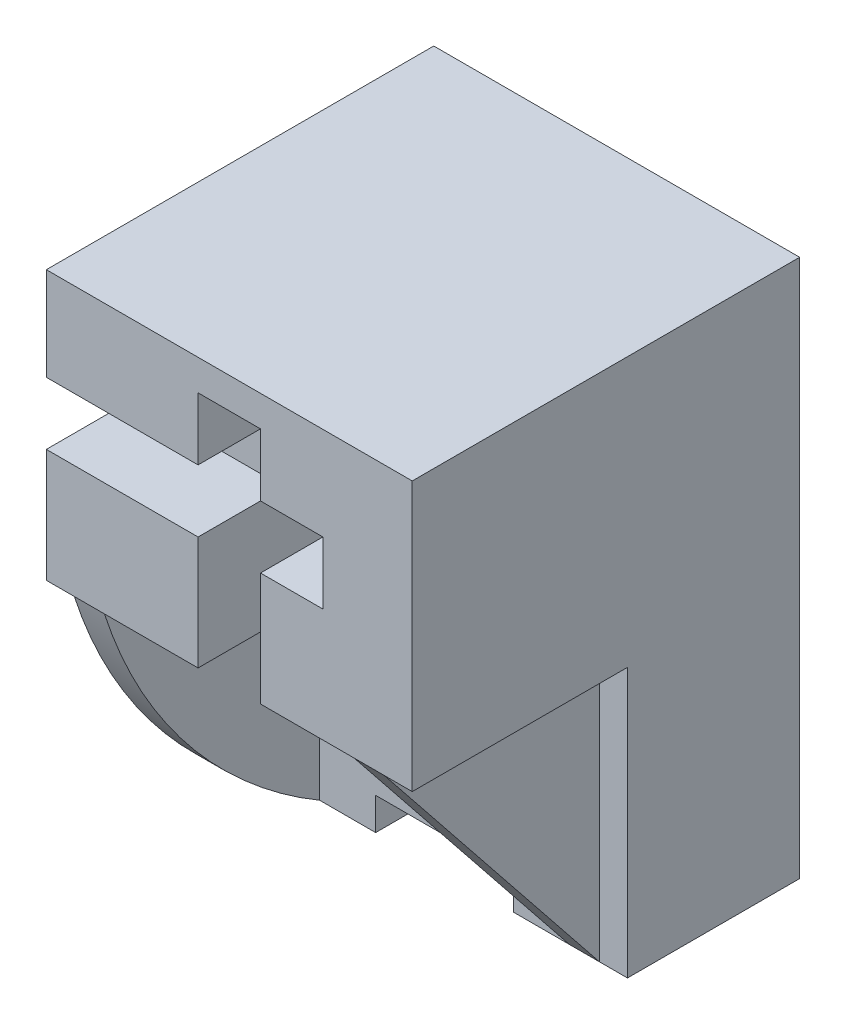
ISO-10303-21;
HEADER;
FILE_DESCRIPTION(('STEP AP214'),'2;1');
FILE_NAME('part.step','',(''),(''),'','','');
FILE_SCHEMA(('AUTOMOTIVE_DESIGN { 1 0 10303 214 1 1 1 1 }'));
ENDSEC;
DATA;
#1=APPLICATION_CONTEXT('core data for automotive mechanical design processes');
#2=APPLICATION_PROTOCOL_DEFINITION('international standard','automotive_design',2000,#1);
#3=PRODUCT_CONTEXT('',#1,'mechanical');
#4=PRODUCT('Part','Part','',(#3));
#5=PRODUCT_RELATED_PRODUCT_CATEGORY('part','',(#4));
#6=PRODUCT_DEFINITION_FORMATION('','',#4);
#7=PRODUCT_DEFINITION_CONTEXT('part definition',#1,'design');
#8=PRODUCT_DEFINITION('design','',#6,#7);
#9=PRODUCT_DEFINITION_SHAPE('','',#8);
#10=(LENGTH_UNIT() NAMED_UNIT(*) SI_UNIT(.MILLI.,.METRE.));
#11=(NAMED_UNIT(*) PLANE_ANGLE_UNIT() SI_UNIT($,.RADIAN.));
#12=(NAMED_UNIT(*) SI_UNIT($,.STERADIAN.) SOLID_ANGLE_UNIT());
#13=UNCERTAINTY_MEASURE_WITH_UNIT(LENGTH_MEASURE(1.E-05),#10,'distance_accuracy_value','');
#14=(GEOMETRIC_REPRESENTATION_CONTEXT(3) GLOBAL_UNCERTAINTY_ASSIGNED_CONTEXT((#13)) GLOBAL_UNIT_ASSIGNED_CONTEXT((#10,
#11,#12)) REPRESENTATION_CONTEXT('',''));
#15=CARTESIAN_POINT('',(0.,0.,0.));
#16=DIRECTION('',(0.,0.,1.));
#17=DIRECTION('',(1.,0.,0.));
#18=AXIS2_PLACEMENT_3D('',#15,#16,#17);
#19=CARTESIAN_POINT('',(0.,0.,40.));
#20=DIRECTION('',(0.,0.,1.));
#21=DIRECTION('',(1.,0.,0.));
#22=AXIS2_PLACEMENT_3D('',#19,#20,#21);
#23=PLANE('',#22);
#24=DIRECTION('',(-1.,0.,0.));
#25=VECTOR('',#24,1.);
#26=CARTESIAN_POINT('',(0.,0.,40.));
#27=LINE('',#26,#25);
#28=CARTESIAN_POINT('',(42.5,0.,40.));
#29=VERTEX_POINT('',#28);
#30=CARTESIAN_POINT('',(36.,0.,40.));
#31=VERTEX_POINT('',#30);
#32=EDGE_CURVE('E290',#29,#31,#27,.T.);
#33=ORIENTED_EDGE('',*,*,#32,.T.);
#34=DIRECTION('',(0.,-1.,0.));
#35=VECTOR('',#34,1.);
#36=CARTESIAN_POINT('',(36.,0.,40.));
#37=LINE('',#36,#35);
#38=CARTESIAN_POINT('',(36.,-62.5,40.));
#39=VERTEX_POINT('',#38);
#40=EDGE_CURVE('E289',#31,#39,#37,.T.);
#41=ORIENTED_EDGE('',*,*,#40,.T.);
#42=DIRECTION('',(1.,0.,0.));
#43=VECTOR('',#42,1.);
#44=CARTESIAN_POINT('',(0.,-62.5,40.));
#45=LINE('',#44,#43);
#46=CARTESIAN_POINT('',(42.5,-62.5,40.));
#47=VERTEX_POINT('',#46);
#48=EDGE_CURVE('E275',#39,#47,#45,.T.);
#49=ORIENTED_EDGE('',*,*,#48,.T.);
#50=DIRECTION('',(0.,1.,0.));
#51=VECTOR('',#50,1.);
#52=CARTESIAN_POINT('',(42.5,0.,40.));
#53=LINE('',#52,#51);
#54=EDGE_CURVE('E357',#47,#29,#53,.T.);
#55=ORIENTED_EDGE('',*,*,#54,.T.);
#56=EDGE_LOOP('',(#33,#41,#49,#55));
#57=FACE_BOUND('',#56,.T.);
#58=ADVANCED_FACE('F82',(#57),#23,.T.);
#59=CARTESIAN_POINT('',(0.,0.,90.));
#60=DIRECTION('',(0.,-1.,0.));
#61=DIRECTION('',(1.,0.,0.));
#62=AXIS2_PLACEMENT_3D('',#59,#60,#61);
#63=PLANE('',#62);
#64=DIRECTION('',(-1.,0.,0.));
#65=VECTOR('',#64,1.);
#66=CARTESIAN_POINT('',(0.,0.,90.));
#67=LINE('',#66,#65);
#68=CARTESIAN_POINT('',(42.5,0.,90.));
#69=VERTEX_POINT('',#68);
#70=CARTESIAN_POINT('',(36.,0.,90.));
#71=VERTEX_POINT('',#70);
#72=EDGE_CURVE('E429',#69,#71,#67,.T.);
#73=ORIENTED_EDGE('',*,*,#72,.T.);
#74=DIRECTION('',(0.,0.,1.));
#75=VECTOR('',#74,1.);
#76=CARTESIAN_POINT('',(36.,0.,40.));
#77=LINE('',#76,#75);
#78=EDGE_CURVE('E105',#31,#71,#77,.T.);
#79=ORIENTED_EDGE('',*,*,#78,.F.);
#80=ORIENTED_EDGE('',*,*,#32,.F.);
#81=DIRECTION('',(0.,0.,-1.));
#82=VECTOR('',#81,1.);
#83=CARTESIAN_POINT('',(42.5,0.,90.));
#84=LINE('',#83,#82);
#85=EDGE_CURVE('E439',#69,#29,#84,.T.);
#86=ORIENTED_EDGE('',*,*,#85,.F.);
#87=EDGE_LOOP('',(#73,#79,#80,#86));
#88=FACE_BOUND('',#87,.T.);
#89=ADVANCED_FACE('F579',(#88),#63,.T.);
#90=DIRECTION('',(-1.,0.,0.));
#91=VECTOR('',#90,1.);
#92=CARTESIAN_POINT('',(0.,0.,90.));
#93=LINE('',#92,#91);
#94=CARTESIAN_POINT('',(-7.24999999999999,0.,90.));
#95=VERTEX_POINT('',#94);
#96=CARTESIAN_POINT('',(-29.,0.,90.));
#97=VERTEX_POINT('',#96);
#98=EDGE_CURVE('E506',#95,#97,#93,.T.);
#99=ORIENTED_EDGE('',*,*,#98,.T.);
#100=DIRECTION('',(0.,0.,1.));
#101=VECTOR('',#100,1.);
#102=CARTESIAN_POINT('',(-29.,0.,90.));
#103=LINE('',#102,#101);
#104=CARTESIAN_POINT('',(-29.,0.,40.));
#105=VERTEX_POINT('',#104);
#106=EDGE_CURVE('E321',#105,#97,#103,.T.);
#107=ORIENTED_EDGE('',*,*,#106,.F.);
#108=DIRECTION('',(1.,0.,0.));
#109=VECTOR('',#108,1.);
#110=CARTESIAN_POINT('',(0.,0.,40.));
#111=LINE('',#110,#109);
#112=CARTESIAN_POINT('',(-7.24999999999998,0.,40.));
#113=VERTEX_POINT('',#112);
#114=EDGE_CURVE('E373',#105,#113,#111,.T.);
#115=ORIENTED_EDGE('',*,*,#114,.T.);
#116=DIRECTION('',(0.,0.,-1.));
#117=VECTOR('',#116,1.);
#118=CARTESIAN_POINT('',(-7.24999999999999,0.,90.));
#119=LINE('',#118,#117);
#120=EDGE_CURVE('E516',#95,#113,#119,.T.);
#121=ORIENTED_EDGE('',*,*,#120,.F.);
#122=EDGE_LOOP('',(#99,#107,#115,#121));
#123=FACE_BOUND('',#122,.T.);
#124=ADVANCED_FACE('F544',(#123),#63,.T.);
#125=DIRECTION('',(0.,-1.,0.));
#126=VECTOR('',#125,1.);
#127=CARTESIAN_POINT('',(29.,0.,40.));
#128=LINE('',#127,#126);
#129=CARTESIAN_POINT('',(29.,0.,40.));
#130=VERTEX_POINT('',#129);
#131=CARTESIAN_POINT('',(29.,-62.5,40.));
#132=VERTEX_POINT('',#131);
#133=EDGE_CURVE('E97',#130,#132,#128,.T.);
#134=ORIENTED_EDGE('',*,*,#133,.F.);
#135=CARTESIAN_POINT('',(7.25000000000001,0.,40.));
#136=VERTEX_POINT('',#135);
#137=EDGE_CURVE('E355',#130,#136,#27,.T.);
#138=ORIENTED_EDGE('',*,*,#137,.T.);
#139=DIRECTION('',(0.,-1.,0.));
#140=VECTOR('',#139,1.);
#141=CARTESIAN_POINT('',(7.25000000000001,26.349803871416,40.));
#142=LINE('',#141,#140);
#143=CARTESIAN_POINT('',(7.25000000000001,26.349803871416,40.));
#144=VERTEX_POINT('',#143);
#145=EDGE_CURVE('E336',#144,#136,#142,.T.);
#146=ORIENTED_EDGE('',*,*,#145,.F.);
#147=DIRECTION('',(1.,0.,0.));
#148=VECTOR('',#147,1.);
#149=CARTESIAN_POINT('',(-7.24999999999998,26.349803871416,40.));
#150=LINE('',#149,#148);
#151=CARTESIAN_POINT('',(-7.24999999999998,26.349803871416,40.));
#152=VERTEX_POINT('',#151);
#153=EDGE_CURVE('E339',#152,#144,#150,.T.);
#154=ORIENTED_EDGE('',*,*,#153,.F.);
#155=DIRECTION('',(0.,1.,0.));
#156=VECTOR('',#155,1.);
#157=CARTESIAN_POINT('',(-7.24999999999998,26.349803871416,40.));
#158=LINE('',#157,#156);
#159=EDGE_CURVE('E342',#113,#152,#158,.T.);
#160=ORIENTED_EDGE('',*,*,#159,.F.);
#161=ORIENTED_EDGE('',*,*,#114,.F.);
#162=DIRECTION('',(0.,1.,0.));
#163=VECTOR('',#162,1.);
#164=CARTESIAN_POINT('',(-29.,0.,40.));
#165=LINE('',#164,#163);
#166=CARTESIAN_POINT('',(-29.,-62.5,40.));
#167=VERTEX_POINT('',#166);
#168=EDGE_CURVE('E317',#167,#105,#165,.T.);
#169=ORIENTED_EDGE('',*,*,#168,.F.);
#170=DIRECTION('',(1.,0.,0.));
#171=VECTOR('',#170,1.);
#172=CARTESIAN_POINT('',(0.,-62.5,40.));
#173=LINE('',#172,#171);
#174=CARTESIAN_POINT('',(-16.,-62.5,40.));
#175=VERTEX_POINT('',#174);
#176=EDGE_CURVE('E372',#167,#175,#173,.T.);
#177=ORIENTED_EDGE('',*,*,#176,.T.);
#178=DIRECTION('',(0.,-1.,0.));
#179=VECTOR('',#178,1.);
#180=CARTESIAN_POINT('',(-16.,0.,40.));
#181=LINE('',#180,#179);
#182=CARTESIAN_POINT('',(-16.,-55.,40.));
#183=VERTEX_POINT('',#182);
#184=EDGE_CURVE('E376',#183,#175,#181,.T.);
#185=ORIENTED_EDGE('',*,*,#184,.F.);
#186=DIRECTION('',(-1.,0.,0.));
#187=VECTOR('',#186,1.);
#188=CARTESIAN_POINT('',(0.,-55.,40.));
#189=LINE('',#188,#187);
#190=CARTESIAN_POINT('',(16.,-55.,40.));
#191=VERTEX_POINT('',#190);
#192=EDGE_CURVE('E379',#191,#183,#189,.T.);
#193=ORIENTED_EDGE('',*,*,#192,.F.);
#194=DIRECTION('',(0.,1.,0.));
#195=VECTOR('',#194,1.);
#196=CARTESIAN_POINT('',(16.,0.,40.));
#197=LINE('',#196,#195);
#198=CARTESIAN_POINT('',(16.,-62.5,40.));
#199=VERTEX_POINT('',#198);
#200=EDGE_CURVE('E286',#199,#191,#197,.T.);
#201=ORIENTED_EDGE('',*,*,#200,.F.);
#202=EDGE_CURVE('E285',#199,#132,#45,.T.);
#203=ORIENTED_EDGE('',*,*,#202,.T.);
#204=EDGE_LOOP('',(#134,#138,#146,#154,#160,#161,#169,#177,#185,#193,#201,#203));
#205=FACE_BOUND('',#204,.T.);
#206=ADVANCED_FACE('F550',(#205),#23,.T.);
#207=DIRECTION('',(0.,0.,1.));
#208=VECTOR('',#207,1.);
#209=CARTESIAN_POINT('',(29.,0.,40.));
#210=LINE('',#209,#208);
#211=CARTESIAN_POINT('',(29.,0.,90.));
#212=VERTEX_POINT('',#211);
#213=EDGE_CURVE('E294',#130,#212,#210,.T.);
#214=ORIENTED_EDGE('',*,*,#213,.T.);
#215=CARTESIAN_POINT('',(7.25000000000001,0.,90.));
#216=VERTEX_POINT('',#215);
#217=EDGE_CURVE('E428',#212,#216,#67,.T.);
#218=ORIENTED_EDGE('',*,*,#217,.T.);
#219=DIRECTION('',(0.,0.,-1.));
#220=VECTOR('',#219,1.);
#221=CARTESIAN_POINT('',(7.25000000000001,0.,90.));
#222=LINE('',#221,#220);
#223=EDGE_CURVE('E442',#216,#136,#222,.T.);
#224=ORIENTED_EDGE('',*,*,#223,.T.);
#225=ORIENTED_EDGE('',*,*,#137,.F.);
#226=EDGE_LOOP('',(#214,#218,#224,#225));
#227=FACE_BOUND('',#226,.T.);
#228=ADVANCED_FACE('F584',(#227),#63,.T.);
#229=DIRECTION('',(0.,0.,1.));
#230=VECTOR('',#229,1.);
#231=CARTESIAN_POINT('',(-36.,0.,90.));
#232=LINE('',#231,#230);
#233=CARTESIAN_POINT('',(-36.,0.,40.));
#234=VERTEX_POINT('',#233);
#235=CARTESIAN_POINT('',(-36.,0.,90.));
#236=VERTEX_POINT('',#235);
#237=EDGE_CURVE('E318',#234,#236,#232,.T.);
#238=ORIENTED_EDGE('',*,*,#237,.T.);
#239=CARTESIAN_POINT('',(-42.5,0.,90.));
#240=VERTEX_POINT('',#239);
#241=EDGE_CURVE('E505',#236,#240,#93,.T.);
#242=ORIENTED_EDGE('',*,*,#241,.T.);
#243=DIRECTION('',(0.,0.,-1.));
#244=VECTOR('',#243,1.);
#245=CARTESIAN_POINT('',(-42.5,0.,90.));
#246=LINE('',#245,#244);
#247=CARTESIAN_POINT('',(-42.5,0.,40.));
#248=VERTEX_POINT('',#247);
#249=EDGE_CURVE('E90',#240,#248,#246,.T.);
#250=ORIENTED_EDGE('',*,*,#249,.T.);
#251=EDGE_CURVE('E369',#248,#234,#111,.T.);
#252=ORIENTED_EDGE('',*,*,#251,.T.);
#253=EDGE_LOOP('',(#238,#242,#250,#252));
#254=FACE_BOUND('',#253,.T.);
#255=ADVANCED_FACE('F521',(#254),#63,.T.);
#256=CARTESIAN_POINT('',(0.,26.349803871416,90.));
#257=DIRECTION('',(0.,1.,0.));
#258=DIRECTION('',(0.,0.,1.));
#259=AXIS2_PLACEMENT_3D('',#256,#257,#258);
#260=PLANE('',#259);
#261=DIRECTION('',(1.,0.,0.));
#262=VECTOR('',#261,1.);
#263=CARTESIAN_POINT('',(0.,26.349803871416,70.));
#264=LINE('',#263,#262);
#265=CARTESIAN_POINT('',(-42.5,26.349803871416,70.));
#266=VERTEX_POINT('',#265);
#267=CARTESIAN_POINT('',(-7.24999999999998,26.349803871416,70.));
#268=VERTEX_POINT('',#267);
#269=EDGE_CURVE('E495',#266,#268,#264,.T.);
#270=ORIENTED_EDGE('',*,*,#269,.F.);
#271=DIRECTION('',(0.,0.,-1.));
#272=VECTOR('',#271,1.);
#273=CARTESIAN_POINT('',(-42.5,26.349803871416,90.));
#274=LINE('',#273,#272);
#275=CARTESIAN_POINT('',(-42.5,26.349803871416,90.));
#276=VERTEX_POINT('',#275);
#277=EDGE_CURVE('E12',#276,#266,#274,.T.);
#278=ORIENTED_EDGE('',*,*,#277,.F.);
#279=DIRECTION('',(1.,0.,0.));
#280=VECTOR('',#279,1.);
#281=CARTESIAN_POINT('',(0.,26.349803871416,90.));
#282=LINE('',#281,#280);
#283=CARTESIAN_POINT('',(-7.24999999999998,26.349803871416,90.));
#284=VERTEX_POINT('',#283);
#285=EDGE_CURVE('E499',#276,#284,#282,.T.);
#286=ORIENTED_EDGE('',*,*,#285,.T.);
#287=DIRECTION('',(0.,0.,-1.));
#288=VECTOR('',#287,1.);
#289=CARTESIAN_POINT('',(-7.24999999999998,26.349803871416,90.));
#290=LINE('',#289,#288);
#291=EDGE_CURVE('E511',#284,#268,#290,.T.);
#292=ORIENTED_EDGE('',*,*,#291,.T.);
#293=EDGE_LOOP('',(#270,#278,#286,#292));
#294=FACE_BOUND('',#293,.T.);
#295=ADVANCED_FACE('F84',(#294),#260,.T.);
#296=CARTESIAN_POINT('',(-42.5,0.,90.));
#297=DIRECTION('',(1.,0.,0.));
#298=DIRECTION('',(0.,0.,-1.));
#299=AXIS2_PLACEMENT_3D('',#296,#297,#298);
#300=PLANE('',#299);
#301=DIRECTION('',(0.,-1.,0.));
#302=VECTOR('',#301,1.);
#303=CARTESIAN_POINT('',(-42.5,0.,0.));
#304=LINE('',#303,#302);
#305=CARTESIAN_POINT('',(-42.5,62.5,0.));
#306=VERTEX_POINT('',#305);
#307=CARTESIAN_POINT('',(-42.5,-62.5,0.));
#308=VERTEX_POINT('',#307);
#309=EDGE_CURVE('E498',#306,#308,#304,.T.);
#310=ORIENTED_EDGE('',*,*,#309,.T.);
#311=DIRECTION('',(0.,0.,-1.));
#312=VECTOR('',#311,1.);
#313=CARTESIAN_POINT('',(-42.5,-62.5,40.));
#314=LINE('',#313,#312);
#315=CARTESIAN_POINT('',(-42.5,-62.5,40.));
#316=VERTEX_POINT('',#315);
#317=EDGE_CURVE('E352',#316,#308,#314,.T.);
#318=ORIENTED_EDGE('',*,*,#317,.F.);
#319=DIRECTION('',(0.,-1.,0.));
#320=VECTOR('',#319,1.);
#321=CARTESIAN_POINT('',(-42.5,0.,40.));
#322=LINE('',#321,#320);
#323=EDGE_CURVE('E344',#248,#316,#322,.T.);
#324=ORIENTED_EDGE('',*,*,#323,.F.);
#325=ORIENTED_EDGE('',*,*,#249,.F.);
#326=DIRECTION('',(0.,-1.,0.));
#327=VECTOR('',#326,1.);
#328=CARTESIAN_POINT('',(-42.5,0.,90.));
#329=LINE('',#328,#327);
#330=EDGE_CURVE('E502',#276,#240,#329,.T.);
#331=ORIENTED_EDGE('',*,*,#330,.F.);
#332=ORIENTED_EDGE('',*,*,#277,.T.);
#333=DIRECTION('',(0.,-1.,0.));
#334=VECTOR('',#333,1.);
#335=CARTESIAN_POINT('',(-42.5,0.,70.));
#336=LINE('',#335,#334);
#337=CARTESIAN_POINT('',(-42.5,40.849803871416,70.));
#338=VERTEX_POINT('',#337);
#339=EDGE_CURVE('E492',#338,#266,#336,.T.);
#340=ORIENTED_EDGE('',*,*,#339,.F.);
#341=DIRECTION('',(0.,0.,-1.));
#342=VECTOR('',#341,1.);
#343=CARTESIAN_POINT('',(-42.5,40.849803871416,90.));
#344=LINE('',#343,#342);
#345=CARTESIAN_POINT('',(-42.5,40.849803871416,90.));
#346=VERTEX_POINT('',#345);
#347=EDGE_CURVE('E466',#346,#338,#344,.T.);
#348=ORIENTED_EDGE('',*,*,#347,.F.);
#349=DIRECTION('',(0.,-1.,0.));
#350=VECTOR('',#349,1.);
#351=CARTESIAN_POINT('',(-42.5,0.,90.));
#352=LINE('',#351,#350);
#353=CARTESIAN_POINT('',(-42.5,62.5,90.));
#354=VERTEX_POINT('',#353);
#355=EDGE_CURVE('E401',#354,#346,#352,.T.);
#356=ORIENTED_EDGE('',*,*,#355,.F.);
#357=DIRECTION('',(0.,0.,-1.));
#358=VECTOR('',#357,1.);
#359=CARTESIAN_POINT('',(-42.5,62.5,90.));
#360=LINE('',#359,#358);
#361=EDGE_CURVE('E468',#354,#306,#360,.T.);
#362=ORIENTED_EDGE('',*,*,#361,.T.);
#363=EDGE_LOOP('',(#310,#318,#324,#325,#331,#332,#340,#348,#356,#362));
#364=FACE_BOUND('',#363,.T.);
#365=ADVANCED_FACE('F527',(#364),#300,.F.);
#366=CARTESIAN_POINT('',(-7.24999999999999,0.,90.));
#367=DIRECTION('',(-1.,0.,0.));
#368=DIRECTION('',(0.,-1.,0.));
#369=AXIS2_PLACEMENT_3D('',#366,#367,#368);
#370=PLANE('',#369);
#371=ORIENTED_EDGE('',*,*,#120,.T.);
#372=ORIENTED_EDGE('',*,*,#159,.T.);
#373=DIRECTION('',(0.,0.,1.));
#374=VECTOR('',#373,1.);
#375=CARTESIAN_POINT('',(-7.24999999999998,26.349803871416,9.92406004690646));
#376=LINE('',#375,#374);
#377=EDGE_CURVE('E340',#152,#268,#376,.T.);
#378=ORIENTED_EDGE('',*,*,#377,.T.);
#379=ORIENTED_EDGE('',*,*,#291,.F.);
#380=DIRECTION('',(0.,1.,0.));
#381=VECTOR('',#380,1.);
#382=CARTESIAN_POINT('',(-7.24999999999999,0.,90.));
#383=LINE('',#382,#381);
#384=EDGE_CURVE('E509',#95,#284,#383,.T.);
#385=ORIENTED_EDGE('',*,*,#384,.F.);
#386=EDGE_LOOP('',(#371,#372,#378,#379,#385));
#387=FACE_BOUND('',#386,.T.);
#388=ADVANCED_FACE('F603',(#387),#370,.F.);
#389=CARTESIAN_POINT('',(0.,0.,90.));
#390=DIRECTION('',(0.,0.,1.));
#391=DIRECTION('',(1.,0.,0.));
#392=AXIS2_PLACEMENT_3D('',#389,#390,#391);
#393=PLANE('',#392);
#394=ORIENTED_EDGE('',*,*,#285,.F.);
#395=ORIENTED_EDGE('',*,*,#330,.T.);
#396=ORIENTED_EDGE('',*,*,#241,.F.);
#397=DIRECTION('',(-1.,0.,0.));
#398=VECTOR('',#397,1.);
#399=CARTESIAN_POINT('',(-29.,0.,90.));
#400=LINE('',#399,#398);
#401=EDGE_CURVE('E324',#97,#236,#400,.T.);
#402=ORIENTED_EDGE('',*,*,#401,.F.);
#403=ORIENTED_EDGE('',*,*,#98,.F.);
#404=ORIENTED_EDGE('',*,*,#384,.T.);
#405=EDGE_LOOP('',(#394,#395,#396,#402,#403,#404));
#406=FACE_BOUND('',#405,.T.);
#407=ADVANCED_FACE('F542',(#406),#393,.T.);
#408=CARTESIAN_POINT('',(0.,0.,0.));
#409=DIRECTION('',(0.,0.,1.));
#410=DIRECTION('',(1.,0.,0.));
#411=AXIS2_PLACEMENT_3D('',#408,#409,#410);
#412=PLANE('',#411);
#413=DIRECTION('',(0.,1.,0.));
#414=VECTOR('',#413,1.);
#415=CARTESIAN_POINT('',(42.5,0.,0.));
#416=LINE('',#415,#414);
#417=CARTESIAN_POINT('',(42.5,-62.5,0.));
#418=VERTEX_POINT('',#417);
#419=CARTESIAN_POINT('',(42.5,62.5,0.));
#420=VERTEX_POINT('',#419);
#421=EDGE_CURVE('E402',#418,#420,#416,.T.);
#422=ORIENTED_EDGE('',*,*,#421,.F.);
#423=DIRECTION('',(1.,0.,0.));
#424=VECTOR('',#423,1.);
#425=CARTESIAN_POINT('',(0.,-62.5,0.));
#426=LINE('',#425,#424);
#427=EDGE_CURVE('E368',#308,#418,#426,.T.);
#428=ORIENTED_EDGE('',*,*,#427,.F.);
#429=ORIENTED_EDGE('',*,*,#309,.F.);
#430=DIRECTION('',(-1.,0.,0.));
#431=VECTOR('',#430,1.);
#432=CARTESIAN_POINT('',(0.,62.5,0.));
#433=LINE('',#432,#431);
#434=EDGE_CURVE('E397',#420,#306,#433,.T.);
#435=ORIENTED_EDGE('',*,*,#434,.F.);
#436=EDGE_LOOP('',(#422,#428,#429,#435));
#437=FACE_BOUND('',#436,.T.);
#438=ADVANCED_FACE('F652',(#437),#412,.F.);
#439=CARTESIAN_POINT('',(0.,0.,70.));
#440=DIRECTION('',(0.,0.,1.));
#441=DIRECTION('',(1.,0.,0.));
#442=AXIS2_PLACEMENT_3D('',#439,#440,#441);
#443=PLANE('',#442);
#444=DIRECTION('',(-1.,0.,0.));
#445=VECTOR('',#444,1.);
#446=CARTESIAN_POINT('',(-7.24999999999998,26.349803871416,70.));
#447=LINE('',#446,#445);
#448=CARTESIAN_POINT('',(7.25000000000001,26.349803871416,70.));
#449=VERTEX_POINT('',#448);
#450=EDGE_CURVE('E335',#449,#268,#447,.T.);
#451=ORIENTED_EDGE('',*,*,#450,.F.);
#452=DIRECTION('',(1.,0.,0.));
#453=VECTOR('',#452,1.);
#454=CARTESIAN_POINT('',(0.,26.349803871416,70.));
#455=LINE('',#454,#453);
#456=CARTESIAN_POINT('',(21.75,26.349803871416,70.));
#457=VERTEX_POINT('',#456);
#458=EDGE_CURVE('E471',#449,#457,#455,.T.);
#459=ORIENTED_EDGE('',*,*,#458,.T.);
#460=DIRECTION('',(0.,1.,0.));
#461=VECTOR('',#460,1.);
#462=CARTESIAN_POINT('',(21.75,0.,70.));
#463=LINE('',#462,#461);
#464=CARTESIAN_POINT('',(21.75,40.849803871416,70.));
#465=VERTEX_POINT('',#464);
#466=EDGE_CURVE('E474',#457,#465,#463,.T.);
#467=ORIENTED_EDGE('',*,*,#466,.T.);
#468=DIRECTION('',(-1.,0.,0.));
#469=VECTOR('',#468,1.);
#470=CARTESIAN_POINT('',(0.,40.849803871416,70.));
#471=LINE('',#470,#469);
#472=CARTESIAN_POINT('',(7.25000000000001,40.849803871416,70.));
#473=VERTEX_POINT('',#472);
#474=EDGE_CURVE('E477',#465,#473,#471,.T.);
#475=ORIENTED_EDGE('',*,*,#474,.T.);
#476=DIRECTION('',(0.,1.,0.));
#477=VECTOR('',#476,1.);
#478=CARTESIAN_POINT('',(7.25000000000001,0.,70.));
#479=LINE('',#478,#477);
#480=CARTESIAN_POINT('',(7.25000000000001,55.349803871416,70.));
#481=VERTEX_POINT('',#480);
#482=EDGE_CURVE('E480',#473,#481,#479,.T.);
#483=ORIENTED_EDGE('',*,*,#482,.T.);
#484=DIRECTION('',(-1.,0.,0.));
#485=VECTOR('',#484,1.);
#486=CARTESIAN_POINT('',(0.,55.349803871416,70.));
#487=LINE('',#486,#485);
#488=CARTESIAN_POINT('',(-7.24999999999999,55.349803871416,70.));
#489=VERTEX_POINT('',#488);
#490=EDGE_CURVE('E483',#481,#489,#487,.T.);
#491=ORIENTED_EDGE('',*,*,#490,.T.);
#492=DIRECTION('',(0.,-1.,0.));
#493=VECTOR('',#492,1.);
#494=CARTESIAN_POINT('',(-7.24999999999998,0.,70.));
#495=LINE('',#494,#493);
#496=CARTESIAN_POINT('',(-7.24999999999998,40.849803871416,70.));
#497=VERTEX_POINT('',#496);
#498=EDGE_CURVE('E486',#489,#497,#495,.T.);
#499=ORIENTED_EDGE('',*,*,#498,.T.);
#500=DIRECTION('',(-1.,0.,0.));
#501=VECTOR('',#500,1.);
#502=CARTESIAN_POINT('',(0.,40.849803871416,70.));
#503=LINE('',#502,#501);
#504=EDGE_CURVE('E489',#497,#338,#503,.T.);
#505=ORIENTED_EDGE('',*,*,#504,.T.);
#506=ORIENTED_EDGE('',*,*,#339,.T.);
#507=ORIENTED_EDGE('',*,*,#269,.T.);
#508=EDGE_LOOP('',(#451,#459,#467,#475,#483,#491,#499,#505,#506,#507));
#509=FACE_BOUND('',#508,.T.);
#510=ADVANCED_FACE('F609',(#509),#443,.T.);
#511=CARTESIAN_POINT('',(0.,62.5,90.));
#512=DIRECTION('',(0.,-1.,0.));
#513=DIRECTION('',(0.,0.,-1.));
#514=AXIS2_PLACEMENT_3D('',#511,#512,#513);
#515=PLANE('',#514);
#516=ORIENTED_EDGE('',*,*,#434,.T.);
#517=ORIENTED_EDGE('',*,*,#361,.F.);
#518=DIRECTION('',(-1.,0.,0.));
#519=VECTOR('',#518,1.);
#520=CARTESIAN_POINT('',(0.,62.5,90.));
#521=LINE('',#520,#519);
#522=CARTESIAN_POINT('',(42.5,62.5,90.));
#523=VERTEX_POINT('',#522);
#524=EDGE_CURVE('E398',#523,#354,#521,.T.);
#525=ORIENTED_EDGE('',*,*,#524,.F.);
#526=DIRECTION('',(0.,0.,-1.));
#527=VECTOR('',#526,1.);
#528=CARTESIAN_POINT('',(42.5,62.5,90.));
#529=LINE('',#528,#527);
#530=EDGE_CURVE('E433',#523,#420,#529,.T.);
#531=ORIENTED_EDGE('',*,*,#530,.T.);
#532=EDGE_LOOP('',(#516,#517,#525,#531));
#533=FACE_BOUND('',#532,.T.);
#534=ADVANCED_FACE('F660',(#533),#515,.F.);
#535=CARTESIAN_POINT('',(0.,40.849803871416,90.));
#536=DIRECTION('',(0.,-1.,0.));
#537=DIRECTION('',(1.,0.,0.));
#538=AXIS2_PLACEMENT_3D('',#535,#536,#537);
#539=PLANE('',#538);
#540=ORIENTED_EDGE('',*,*,#347,.T.);
#541=ORIENTED_EDGE('',*,*,#504,.F.);
#542=DIRECTION('',(0.,0.,-1.));
#543=VECTOR('',#542,1.);
#544=CARTESIAN_POINT('',(-7.24999999999998,40.849803871416,90.));
#545=LINE('',#544,#543);
#546=CARTESIAN_POINT('',(-7.24999999999998,40.849803871416,90.));
#547=VERTEX_POINT('',#546);
#548=EDGE_CURVE('E463',#547,#497,#545,.T.);
#549=ORIENTED_EDGE('',*,*,#548,.F.);
#550=DIRECTION('',(-1.,0.,0.));
#551=VECTOR('',#550,1.);
#552=CARTESIAN_POINT('',(0.,40.849803871416,90.));
#553=LINE('',#552,#551);
#554=EDGE_CURVE('E404',#547,#346,#553,.T.);
#555=ORIENTED_EDGE('',*,*,#554,.T.);
#556=EDGE_LOOP('',(#540,#541,#549,#555));
#557=FACE_BOUND('',#556,.T.);
#558=ADVANCED_FACE('F611',(#557),#539,.T.);
#559=CARTESIAN_POINT('',(-7.24999999999998,0.,90.));
#560=DIRECTION('',(1.,0.,0.));
#561=DIRECTION('',(0.,1.,0.));
#562=AXIS2_PLACEMENT_3D('',#559,#560,#561);
#563=PLANE('',#562);
#564=ORIENTED_EDGE('',*,*,#548,.T.);
#565=ORIENTED_EDGE('',*,*,#498,.F.);
#566=DIRECTION('',(0.,0.,-1.));
#567=VECTOR('',#566,1.);
#568=CARTESIAN_POINT('',(-7.24999999999999,55.349803871416,90.));
#569=LINE('',#568,#567);
#570=CARTESIAN_POINT('',(-7.24999999999999,55.349803871416,90.));
#571=VERTEX_POINT('',#570);
#572=EDGE_CURVE('E460',#571,#489,#569,.T.);
#573=ORIENTED_EDGE('',*,*,#572,.F.);
#574=DIRECTION('',(0.,-1.,0.));
#575=VECTOR('',#574,1.);
#576=CARTESIAN_POINT('',(-7.24999999999998,0.,90.));
#577=LINE('',#576,#575);
#578=EDGE_CURVE('E407',#571,#547,#577,.T.);
#579=ORIENTED_EDGE('',*,*,#578,.T.);
#580=EDGE_LOOP('',(#564,#565,#573,#579));
#581=FACE_BOUND('',#580,.T.);
#582=ADVANCED_FACE('F614',(#581),#563,.T.);
#583=CARTESIAN_POINT('',(0.,55.349803871416,90.));
#584=DIRECTION('',(0.,-1.,0.));
#585=DIRECTION('',(1.,0.,0.));
#586=AXIS2_PLACEMENT_3D('',#583,#584,#585);
#587=PLANE('',#586);
#588=ORIENTED_EDGE('',*,*,#572,.T.);
#589=ORIENTED_EDGE('',*,*,#490,.F.);
#590=DIRECTION('',(0.,0.,-1.));
#591=VECTOR('',#590,1.);
#592=CARTESIAN_POINT('',(7.25000000000001,55.349803871416,90.));
#593=LINE('',#592,#591);
#594=CARTESIAN_POINT('',(7.25000000000001,55.349803871416,90.));
#595=VERTEX_POINT('',#594);
#596=EDGE_CURVE('E457',#595,#481,#593,.T.);
#597=ORIENTED_EDGE('',*,*,#596,.F.);
#598=DIRECTION('',(-1.,0.,0.));
#599=VECTOR('',#598,1.);
#600=CARTESIAN_POINT('',(0.,55.349803871416,90.));
#601=LINE('',#600,#599);
#602=EDGE_CURVE('E410',#595,#571,#601,.T.);
#603=ORIENTED_EDGE('',*,*,#602,.T.);
#604=EDGE_LOOP('',(#588,#589,#597,#603));
#605=FACE_BOUND('',#604,.T.);
#606=ADVANCED_FACE('F621',(#605),#587,.T.);
#607=CARTESIAN_POINT('',(7.25000000000001,0.,90.));
#608=DIRECTION('',(-1.,0.,0.));
#609=DIRECTION('',(0.,-1.,0.));
#610=AXIS2_PLACEMENT_3D('',#607,#608,#609);
#611=PLANE('',#610);
#612=ORIENTED_EDGE('',*,*,#596,.T.);
#613=ORIENTED_EDGE('',*,*,#482,.F.);
#614=DIRECTION('',(0.,0.,-1.));
#615=VECTOR('',#614,1.);
#616=CARTESIAN_POINT('',(7.25000000000001,40.849803871416,90.));
#617=LINE('',#616,#615);
#618=CARTESIAN_POINT('',(7.25000000000001,40.849803871416,90.));
#619=VERTEX_POINT('',#618);
#620=EDGE_CURVE('E454',#619,#473,#617,.T.);
#621=ORIENTED_EDGE('',*,*,#620,.F.);
#622=DIRECTION('',(0.,1.,0.));
#623=VECTOR('',#622,1.);
#624=CARTESIAN_POINT('',(7.25000000000001,0.,90.));
#625=LINE('',#624,#623);
#626=EDGE_CURVE('E413',#619,#595,#625,.T.);
#627=ORIENTED_EDGE('',*,*,#626,.T.);
#628=EDGE_LOOP('',(#612,#613,#621,#627));
#629=FACE_BOUND('',#628,.T.);
#630=ADVANCED_FACE('F623',(#629),#611,.T.);
#631=CARTESIAN_POINT('',(0.,40.849803871416,90.));
#632=DIRECTION('',(0.,-1.,0.));
#633=DIRECTION('',(1.,0.,0.));
#634=AXIS2_PLACEMENT_3D('',#631,#632,#633);
#635=PLANE('',#634);
#636=ORIENTED_EDGE('',*,*,#620,.T.);
#637=ORIENTED_EDGE('',*,*,#474,.F.);
#638=DIRECTION('',(0.,0.,-1.));
#639=VECTOR('',#638,1.);
#640=CARTESIAN_POINT('',(21.75,40.849803871416,90.));
#641=LINE('',#640,#639);
#642=CARTESIAN_POINT('',(21.75,40.849803871416,90.));
#643=VERTEX_POINT('',#642);
#644=EDGE_CURVE('E451',#643,#465,#641,.T.);
#645=ORIENTED_EDGE('',*,*,#644,.F.);
#646=DIRECTION('',(-1.,0.,0.));
#647=VECTOR('',#646,1.);
#648=CARTESIAN_POINT('',(0.,40.849803871416,90.));
#649=LINE('',#648,#647);
#650=EDGE_CURVE('E416',#643,#619,#649,.T.);
#651=ORIENTED_EDGE('',*,*,#650,.T.);
#652=EDGE_LOOP('',(#636,#637,#645,#651));
#653=FACE_BOUND('',#652,.T.);
#654=ADVANCED_FACE('F625',(#653),#635,.T.);
#655=CARTESIAN_POINT('',(21.75,0.,90.));
#656=DIRECTION('',(-1.,0.,0.));
#657=DIRECTION('',(0.,-1.,0.));
#658=AXIS2_PLACEMENT_3D('',#655,#656,#657);
#659=PLANE('',#658);
#660=ORIENTED_EDGE('',*,*,#644,.T.);
#661=ORIENTED_EDGE('',*,*,#466,.F.);
#662=DIRECTION('',(0.,0.,-1.));
#663=VECTOR('',#662,1.);
#664=CARTESIAN_POINT('',(21.75,26.349803871416,90.));
#665=LINE('',#664,#663);
#666=CARTESIAN_POINT('',(21.75,26.349803871416,90.));
#667=VERTEX_POINT('',#666);
#668=EDGE_CURVE('E448',#667,#457,#665,.T.);
#669=ORIENTED_EDGE('',*,*,#668,.F.);
#670=DIRECTION('',(0.,1.,0.));
#671=VECTOR('',#670,1.);
#672=CARTESIAN_POINT('',(21.75,0.,90.));
#673=LINE('',#672,#671);
#674=EDGE_CURVE('E419',#667,#643,#673,.T.);
#675=ORIENTED_EDGE('',*,*,#674,.T.);
#676=EDGE_LOOP('',(#660,#661,#669,#675));
#677=FACE_BOUND('',#676,.T.);
#678=ADVANCED_FACE('F628',(#677),#659,.T.);
#679=CARTESIAN_POINT('',(0.,26.349803871416,90.));
#680=DIRECTION('',(0.,1.,0.));
#681=DIRECTION('',(-1.,0.,0.));
#682=AXIS2_PLACEMENT_3D('',#679,#680,#681);
#683=PLANE('',#682);
#684=ORIENTED_EDGE('',*,*,#668,.T.);
#685=ORIENTED_EDGE('',*,*,#458,.F.);
#686=DIRECTION('',(0.,0.,-1.));
#687=VECTOR('',#686,1.);
#688=CARTESIAN_POINT('',(7.25000000000001,26.349803871416,90.));
#689=LINE('',#688,#687);
#690=CARTESIAN_POINT('',(7.25000000000001,26.349803871416,90.));
#691=VERTEX_POINT('',#690);
#692=EDGE_CURVE('E445',#691,#449,#689,.T.);
#693=ORIENTED_EDGE('',*,*,#692,.F.);
#694=DIRECTION('',(1.,0.,0.));
#695=VECTOR('',#694,1.);
#696=CARTESIAN_POINT('',(0.,26.349803871416,90.));
#697=LINE('',#696,#695);
#698=EDGE_CURVE('E422',#691,#667,#697,.T.);
#699=ORIENTED_EDGE('',*,*,#698,.T.);
#700=EDGE_LOOP('',(#684,#685,#693,#699));
#701=FACE_BOUND('',#700,.T.);
#702=ADVANCED_FACE('F633',(#701),#683,.T.);
#703=CARTESIAN_POINT('',(7.25000000000001,0.,90.));
#704=DIRECTION('',(-1.,0.,0.));
#705=DIRECTION('',(0.,-1.,0.));
#706=AXIS2_PLACEMENT_3D('',#703,#704,#705);
#707=PLANE('',#706);
#708=ORIENTED_EDGE('',*,*,#692,.T.);
#709=DIRECTION('',(0.,0.,1.));
#710=VECTOR('',#709,1.);
#711=CARTESIAN_POINT('',(7.25000000000001,26.349803871416,9.92406004690646));
#712=LINE('',#711,#710);
#713=EDGE_CURVE('E347',#144,#449,#712,.T.);
#714=ORIENTED_EDGE('',*,*,#713,.F.);
#715=ORIENTED_EDGE('',*,*,#145,.T.);
#716=ORIENTED_EDGE('',*,*,#223,.F.);
#717=DIRECTION('',(0.,1.,0.));
#718=VECTOR('',#717,1.);
#719=CARTESIAN_POINT('',(7.25000000000001,0.,90.));
#720=LINE('',#719,#718);
#721=EDGE_CURVE('E425',#216,#691,#720,.T.);
#722=ORIENTED_EDGE('',*,*,#721,.T.);
#723=EDGE_LOOP('',(#708,#714,#715,#716,#722));
#724=FACE_BOUND('',#723,.T.);
#725=ADVANCED_FACE('F637',(#724),#707,.T.);
#726=CARTESIAN_POINT('',(42.5,0.,90.));
#727=DIRECTION('',(-1.,0.,0.));
#728=DIRECTION('',(0.,0.,1.));
#729=AXIS2_PLACEMENT_3D('',#726,#727,#728);
#730=PLANE('',#729);
#731=ORIENTED_EDGE('',*,*,#421,.T.);
#732=ORIENTED_EDGE('',*,*,#530,.F.);
#733=DIRECTION('',(0.,1.,0.));
#734=VECTOR('',#733,1.);
#735=CARTESIAN_POINT('',(42.5,0.,90.));
#736=LINE('',#735,#734);
#737=EDGE_CURVE('E431',#69,#523,#736,.T.);
#738=ORIENTED_EDGE('',*,*,#737,.F.);
#739=ORIENTED_EDGE('',*,*,#85,.T.);
#740=ORIENTED_EDGE('',*,*,#54,.F.);
#741=DIRECTION('',(0.,0.,-1.));
#742=VECTOR('',#741,1.);
#743=CARTESIAN_POINT('',(42.5,-62.5,40.));
#744=LINE('',#743,#742);
#745=EDGE_CURVE('E282',#47,#418,#744,.T.);
#746=ORIENTED_EDGE('',*,*,#745,.T.);
#747=EDGE_LOOP('',(#731,#732,#738,#739,#740,#746));
#748=FACE_BOUND('',#747,.T.);
#749=ADVANCED_FACE('F680',(#748),#730,.F.);
#750=CARTESIAN_POINT('',(0.,0.,90.));
#751=DIRECTION('',(0.,0.,1.));
#752=DIRECTION('',(1.,0.,0.));
#753=AXIS2_PLACEMENT_3D('',#750,#751,#752);
#754=PLANE('',#753);
#755=ORIENTED_EDGE('',*,*,#524,.T.);
#756=ORIENTED_EDGE('',*,*,#355,.T.);
#757=ORIENTED_EDGE('',*,*,#554,.F.);
#758=ORIENTED_EDGE('',*,*,#578,.F.);
#759=ORIENTED_EDGE('',*,*,#602,.F.);
#760=ORIENTED_EDGE('',*,*,#626,.F.);
#761=ORIENTED_EDGE('',*,*,#650,.F.);
#762=ORIENTED_EDGE('',*,*,#674,.F.);
#763=ORIENTED_EDGE('',*,*,#698,.F.);
#764=ORIENTED_EDGE('',*,*,#721,.F.);
#765=ORIENTED_EDGE('',*,*,#217,.F.);
#766=DIRECTION('',(-1.,0.,0.));
#767=VECTOR('',#766,1.);
#768=CARTESIAN_POINT('',(36.,0.,90.));
#769=LINE('',#768,#767);
#770=EDGE_CURVE('E303',#71,#212,#769,.T.);
#771=ORIENTED_EDGE('',*,*,#770,.F.);
#772=ORIENTED_EDGE('',*,*,#72,.F.);
#773=ORIENTED_EDGE('',*,*,#737,.T.);
#774=EDGE_LOOP('',(#755,#756,#757,#758,#759,#760,#761,#762,#763,#764,#765,#771,#772,#773));
#775=FACE_BOUND('',#774,.T.);
#776=ADVANCED_FACE('F618',(#775),#754,.T.);
#777=CARTESIAN_POINT('',(0.,-62.5,40.));
#778=DIRECTION('',(0.,1.,0.));
#779=DIRECTION('',(0.,0.,1.));
#780=AXIS2_PLACEMENT_3D('',#777,#778,#779);
#781=PLANE('',#780);
#782=ORIENTED_EDGE('',*,*,#427,.T.);
#783=ORIENTED_EDGE('',*,*,#745,.F.);
#784=ORIENTED_EDGE('',*,*,#48,.F.);
#785=DIRECTION('',(-1.,0.,0.));
#786=VECTOR('',#785,1.);
#787=CARTESIAN_POINT('',(36.,-62.5,40.));
#788=LINE('',#787,#786);
#789=EDGE_CURVE('E280',#39,#132,#788,.T.);
#790=ORIENTED_EDGE('',*,*,#789,.T.);
#791=ORIENTED_EDGE('',*,*,#202,.F.);
#792=DIRECTION('',(0.,0.,-1.));
#793=VECTOR('',#792,1.);
#794=CARTESIAN_POINT('',(16.,-62.5,40.));
#795=LINE('',#794,#793);
#796=CARTESIAN_POINT('',(16.,-62.5,30.));
#797=VERTEX_POINT('',#796);
#798=EDGE_CURVE('E384',#199,#797,#795,.T.);
#799=ORIENTED_EDGE('',*,*,#798,.T.);
#800=DIRECTION('',(1.,0.,0.));
#801=VECTOR('',#800,1.);
#802=CARTESIAN_POINT('',(0.,-62.5,30.));
#803=LINE('',#802,#801);
#804=CARTESIAN_POINT('',(-16.,-62.5,30.));
#805=VERTEX_POINT('',#804);
#806=EDGE_CURVE('E364',#805,#797,#803,.T.);
#807=ORIENTED_EDGE('',*,*,#806,.F.);
#808=DIRECTION('',(0.,0.,-1.));
#809=VECTOR('',#808,1.);
#810=CARTESIAN_POINT('',(-16.,-62.5,40.));
#811=LINE('',#810,#809);
#812=EDGE_CURVE('E394',#175,#805,#811,.T.);
#813=ORIENTED_EDGE('',*,*,#812,.F.);
#814=ORIENTED_EDGE('',*,*,#176,.F.);
#815=DIRECTION('',(-1.,0.,0.));
#816=VECTOR('',#815,1.);
#817=CARTESIAN_POINT('',(-29.,-62.5,40.));
#818=LINE('',#817,#816);
#819=CARTESIAN_POINT('',(-36.,-62.5,40.));
#820=VERTEX_POINT('',#819);
#821=EDGE_CURVE('E332',#167,#820,#818,.T.);
#822=ORIENTED_EDGE('',*,*,#821,.T.);
#823=EDGE_CURVE('E374',#316,#820,#173,.T.);
#824=ORIENTED_EDGE('',*,*,#823,.F.);
#825=ORIENTED_EDGE('',*,*,#317,.T.);
#826=EDGE_LOOP('',(#782,#783,#784,#790,#791,#799,#807,#813,#814,#822,#824,#825));
#827=FACE_BOUND('',#826,.T.);
#828=ADVANCED_FACE('F277',(#827),#781,.F.);
#829=CARTESIAN_POINT('',(-16.,0.,40.));
#830=DIRECTION('',(1.,0.,0.));
#831=DIRECTION('',(0.,0.,-1.));
#832=AXIS2_PLACEMENT_3D('',#829,#830,#831);
#833=PLANE('',#832);
#834=DIRECTION('',(0.,-1.,0.));
#835=VECTOR('',#834,1.);
#836=CARTESIAN_POINT('',(-16.,0.,30.));
#837=LINE('',#836,#835);
#838=CARTESIAN_POINT('',(-16.,-55.,30.));
#839=VERTEX_POINT('',#838);
#840=EDGE_CURVE('E362',#839,#805,#837,.T.);
#841=ORIENTED_EDGE('',*,*,#840,.F.);
#842=DIRECTION('',(0.,0.,-1.));
#843=VECTOR('',#842,1.);
#844=CARTESIAN_POINT('',(-16.,-55.,40.));
#845=LINE('',#844,#843);
#846=EDGE_CURVE('E391',#183,#839,#845,.T.);
#847=ORIENTED_EDGE('',*,*,#846,.F.);
#848=ORIENTED_EDGE('',*,*,#184,.T.);
#849=ORIENTED_EDGE('',*,*,#812,.T.);
#850=EDGE_LOOP('',(#841,#847,#848,#849));
#851=FACE_BOUND('',#850,.T.);
#852=ADVANCED_FACE('F557',(#851),#833,.T.);
#853=CARTESIAN_POINT('',(0.,-55.,40.));
#854=DIRECTION('',(0.,-1.,0.));
#855=DIRECTION('',(0.,0.,-1.));
#856=AXIS2_PLACEMENT_3D('',#853,#854,#855);
#857=PLANE('',#856);
#858=DIRECTION('',(-1.,0.,0.));
#859=VECTOR('',#858,1.);
#860=CARTESIAN_POINT('',(0.,-55.,30.));
#861=LINE('',#860,#859);
#862=CARTESIAN_POINT('',(16.,-55.,30.));
#863=VERTEX_POINT('',#862);
#864=EDGE_CURVE('E360',#863,#839,#861,.T.);
#865=ORIENTED_EDGE('',*,*,#864,.F.);
#866=DIRECTION('',(0.,0.,-1.));
#867=VECTOR('',#866,1.);
#868=CARTESIAN_POINT('',(16.,-55.,40.));
#869=LINE('',#868,#867);
#870=EDGE_CURVE('E388',#191,#863,#869,.T.);
#871=ORIENTED_EDGE('',*,*,#870,.F.);
#872=ORIENTED_EDGE('',*,*,#192,.T.);
#873=ORIENTED_EDGE('',*,*,#846,.T.);
#874=EDGE_LOOP('',(#865,#871,#872,#873));
#875=FACE_BOUND('',#874,.T.);
#876=ADVANCED_FACE('F562',(#875),#857,.T.);
#877=CARTESIAN_POINT('',(16.,0.,40.));
#878=DIRECTION('',(-1.,0.,0.));
#879=DIRECTION('',(0.,0.,1.));
#880=AXIS2_PLACEMENT_3D('',#877,#878,#879);
#881=PLANE('',#880);
#882=DIRECTION('',(0.,1.,0.));
#883=VECTOR('',#882,1.);
#884=CARTESIAN_POINT('',(16.,0.,30.));
#885=LINE('',#884,#883);
#886=EDGE_CURVE('E366',#797,#863,#885,.T.);
#887=ORIENTED_EDGE('',*,*,#886,.F.);
#888=ORIENTED_EDGE('',*,*,#798,.F.);
#889=ORIENTED_EDGE('',*,*,#200,.T.);
#890=ORIENTED_EDGE('',*,*,#870,.T.);
#891=EDGE_LOOP('',(#887,#888,#889,#890));
#892=FACE_BOUND('',#891,.T.);
#893=ADVANCED_FACE('F565',(#892),#881,.T.);
#894=DIRECTION('',(0.,1.,0.));
#895=VECTOR('',#894,1.);
#896=CARTESIAN_POINT('',(-36.,0.,40.));
#897=LINE('',#896,#895);
#898=EDGE_CURVE('E327',#820,#234,#897,.T.);
#899=ORIENTED_EDGE('',*,*,#898,.T.);
#900=ORIENTED_EDGE('',*,*,#251,.F.);
#901=ORIENTED_EDGE('',*,*,#323,.T.);
#902=ORIENTED_EDGE('',*,*,#823,.T.);
#903=EDGE_LOOP('',(#899,#900,#901,#902));
#904=FACE_BOUND('',#903,.T.);
#905=ADVANCED_FACE('F531',(#904),#23,.T.);
#906=CARTESIAN_POINT('',(0.,0.,30.));
#907=DIRECTION('',(0.,0.,1.));
#908=DIRECTION('',(1.,0.,0.));
#909=AXIS2_PLACEMENT_3D('',#906,#907,#908);
#910=PLANE('',#909);
#911=ORIENTED_EDGE('',*,*,#864,.T.);
#912=ORIENTED_EDGE('',*,*,#840,.T.);
#913=ORIENTED_EDGE('',*,*,#806,.T.);
#914=ORIENTED_EDGE('',*,*,#886,.T.);
#915=EDGE_LOOP('',(#911,#912,#913,#914));
#916=FACE_BOUND('',#915,.T.);
#917=ADVANCED_FACE('F567',(#916),#910,.T.);
#918=CARTESIAN_POINT('',(-7.24999999999998,26.349803871416,9.92406004690646));
#919=DIRECTION('',(0.,1.,0.));
#920=DIRECTION('',(0.,0.,1.));
#921=AXIS2_PLACEMENT_3D('',#918,#919,#920);
#922=PLANE('',#921);
#923=ORIENTED_EDGE('',*,*,#153,.T.);
#924=ORIENTED_EDGE('',*,*,#713,.T.);
#925=ORIENTED_EDGE('',*,*,#450,.T.);
#926=ORIENTED_EDGE('',*,*,#377,.F.);
#927=EDGE_LOOP('',(#923,#924,#925,#926));
#928=FACE_BOUND('',#927,.T.);
#929=ADVANCED_FACE('F569',(#928),#922,.F.);
#930=CARTESIAN_POINT('',(-29.,34.5044925809888,-17.1931157262361));
#931=DIRECTION('',(-1.,0.,0.));
#932=DIRECTION('',(0.,0.,1.));
#933=AXIS2_PLACEMENT_3D('',#930,#931,#932);
#934=CYLINDRICAL_SURFACE('',#933,112.609609125375);
#935=CARTESIAN_POINT('',(-36.,34.5044925809888,-17.1931157262361));
#936=DIRECTION('',(1.,0.,0.));
#937=DIRECTION('',(0.,0.,1.));
#938=AXIS2_PLACEMENT_3D('',#935,#936,#937);
#939=CIRCLE('',#938,112.609609125375);
#940=EDGE_CURVE('E312',#236,#820,#939,.T.);
#941=ORIENTED_EDGE('',*,*,#940,.T.);
#942=ORIENTED_EDGE('',*,*,#821,.F.);
#943=CARTESIAN_POINT('',(-29.,34.5044925809888,-17.1931157262361));
#944=DIRECTION('',(1.,0.,0.));
#945=DIRECTION('',(0.,0.,1.));
#946=AXIS2_PLACEMENT_3D('',#943,#944,#945);
#947=CIRCLE('',#946,112.609609125375);
#948=EDGE_CURVE('E314',#97,#167,#947,.T.);
#949=ORIENTED_EDGE('',*,*,#948,.F.);
#950=ORIENTED_EDGE('',*,*,#401,.T.);
#951=EDGE_LOOP('',(#941,#942,#949,#950));
#952=FACE_BOUND('',#951,.T.);
#953=ADVANCED_FACE('F538',(#952),#934,.T.);
#954=CARTESIAN_POINT('',(-29.,34.5044925809888,-17.1931157262361));
#955=DIRECTION('',(-1.,0.,0.));
#956=DIRECTION('',(0.,0.,1.));
#957=AXIS2_PLACEMENT_3D('',#954,#955,#956);
#958=PLANE('',#957);
#959=ORIENTED_EDGE('',*,*,#948,.T.);
#960=ORIENTED_EDGE('',*,*,#168,.T.);
#961=ORIENTED_EDGE('',*,*,#106,.T.);
#962=EDGE_LOOP('',(#959,#960,#961));
#963=FACE_BOUND('',#962,.T.);
#964=ADVANCED_FACE('F548',(#963),#958,.F.);
#965=CARTESIAN_POINT('',(-36.,34.5044925809888,-17.1931157262361));
#966=DIRECTION('',(-1.,0.,0.));
#967=DIRECTION('',(0.,0.,1.));
#968=AXIS2_PLACEMENT_3D('',#965,#966,#967);
#969=PLANE('',#968);
#970=ORIENTED_EDGE('',*,*,#940,.F.);
#971=ORIENTED_EDGE('',*,*,#237,.F.);
#972=ORIENTED_EDGE('',*,*,#898,.F.);
#973=EDGE_LOOP('',(#970,#971,#972));
#974=FACE_BOUND('',#973,.T.);
#975=ADVANCED_FACE('F535',(#974),#969,.T.);
#976=CARTESIAN_POINT('',(36.,-62.5,40.));
#977=DIRECTION('',(0.,-0.624695047554424,0.78086880944303));
#978=DIRECTION('',(0.,-0.78086880944303,-0.624695047554424));
#979=AXIS2_PLACEMENT_3D('',#976,#977,#978);
#980=PLANE('',#979);
#981=DIRECTION('',(0.,0.78086880944303,0.624695047554424));
#982=VECTOR('',#981,1.);
#983=CARTESIAN_POINT('',(29.,-62.5,40.));
#984=LINE('',#983,#982);
#985=EDGE_CURVE('E302',#132,#212,#984,.T.);
#986=ORIENTED_EDGE('',*,*,#985,.F.);
#987=ORIENTED_EDGE('',*,*,#789,.F.);
#988=DIRECTION('',(0.,0.78086880944303,0.624695047554424));
#989=VECTOR('',#988,1.);
#990=CARTESIAN_POINT('',(36.,-62.5,40.));
#991=LINE('',#990,#989);
#992=EDGE_CURVE('E293',#39,#71,#991,.T.);
#993=ORIENTED_EDGE('',*,*,#992,.T.);
#994=ORIENTED_EDGE('',*,*,#770,.T.);
#995=EDGE_LOOP('',(#986,#987,#993,#994));
#996=FACE_BOUND('',#995,.T.);
#997=ADVANCED_FACE('F299',(#996),#980,.T.);
#998=CARTESIAN_POINT('',(36.,0.,0.));
#999=DIRECTION('',(-1.,0.,0.));
#1000=DIRECTION('',(0.,0.,1.));
#1001=AXIS2_PLACEMENT_3D('',#998,#999,#1000);
#1002=PLANE('',#1001);
#1003=ORIENTED_EDGE('',*,*,#40,.F.);
#1004=ORIENTED_EDGE('',*,*,#78,.T.);
#1005=ORIENTED_EDGE('',*,*,#992,.F.);
#1006=EDGE_LOOP('',(#1003,#1004,#1005));
#1007=FACE_BOUND('',#1006,.T.);
#1008=ADVANCED_FACE('F305',(#1007),#1002,.F.);
#1009=CARTESIAN_POINT('',(29.,0.,0.));
#1010=DIRECTION('',(-1.,0.,0.));
#1011=DIRECTION('',(0.,0.,1.));
#1012=AXIS2_PLACEMENT_3D('',#1009,#1010,#1011);
#1013=PLANE('',#1012);
#1014=ORIENTED_EDGE('',*,*,#133,.T.);
#1015=ORIENTED_EDGE('',*,*,#985,.T.);
#1016=ORIENTED_EDGE('',*,*,#213,.F.);
#1017=EDGE_LOOP('',(#1014,#1015,#1016));
#1018=FACE_BOUND('',#1017,.T.);
#1019=ADVANCED_FACE('F643',(#1018),#1013,.T.);
#1020=CLOSED_SHELL('',(#58,#89,#124,#206,#228,#255,#295,#365,#388,#407,#438,#510,#534,#558,#582,
#606,#630,#654,#678,#702,#725,#749,#776,#828,#852,#876,#893,#905,#917,#929,#953,#964,#975,#997,
#1008,#1019));
#1021=MANIFOLD_SOLID_BREP('B2',#1020);
#1022=ADVANCED_BREP_SHAPE_REPRESENTATION('',(#18,#1021),#14);
#1023=SHAPE_DEFINITION_REPRESENTATION(#9,#1022);
ENDSEC;
END-ISO-10303-21;
